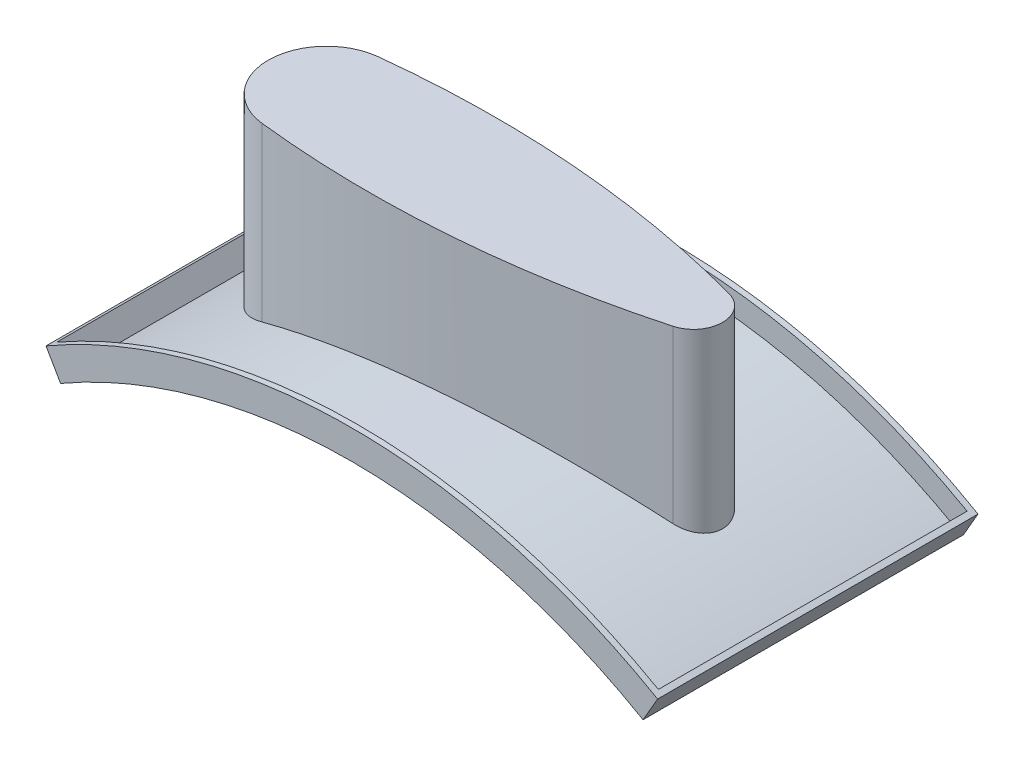
ISO-10303-21;
HEADER;
FILE_DESCRIPTION(('STEP AP214'),'2;1');
FILE_NAME('part.step','',(''),(''),'','','');
FILE_SCHEMA(('AUTOMOTIVE_DESIGN { 1 0 10303 214 1 1 1 1 }'));
ENDSEC;
DATA;
#1=APPLICATION_CONTEXT('core data for automotive mechanical design processes');
#2=APPLICATION_PROTOCOL_DEFINITION('international standard','automotive_design',2000,#1);
#3=PRODUCT_CONTEXT('',#1,'mechanical');
#4=PRODUCT('Part','Part','',(#3));
#5=PRODUCT_RELATED_PRODUCT_CATEGORY('part','',(#4));
#6=PRODUCT_DEFINITION_FORMATION('','',#4);
#7=PRODUCT_DEFINITION_CONTEXT('part definition',#1,'design');
#8=PRODUCT_DEFINITION('design','',#6,#7);
#9=PRODUCT_DEFINITION_SHAPE('','',#8);
#10=(LENGTH_UNIT() NAMED_UNIT(*) SI_UNIT(.MILLI.,.METRE.));
#11=(NAMED_UNIT(*) PLANE_ANGLE_UNIT() SI_UNIT($,.RADIAN.));
#12=(NAMED_UNIT(*) SI_UNIT($,.STERADIAN.) SOLID_ANGLE_UNIT());
#13=UNCERTAINTY_MEASURE_WITH_UNIT(LENGTH_MEASURE(1.E-05),#10,'distance_accuracy_value','');
#14=(GEOMETRIC_REPRESENTATION_CONTEXT(3) GLOBAL_UNCERTAINTY_ASSIGNED_CONTEXT((#13)) GLOBAL_UNIT_ASSIGNED_CONTEXT((#10,
#11,#12)) REPRESENTATION_CONTEXT('',''));
#15=CARTESIAN_POINT('',(0.,0.,0.));
#16=DIRECTION('',(0.,0.,1.));
#17=DIRECTION('',(1.,0.,0.));
#18=AXIS2_PLACEMENT_3D('',#15,#16,#17);
#19=CARTESIAN_POINT('',(0.,0.,-110.));
#20=DIRECTION('',(0.,0.,1.));
#21=DIRECTION('',(1.,0.,0.));
#22=AXIS2_PLACEMENT_3D('',#19,#20,#21);
#23=CYLINDRICAL_SURFACE('',#22,210.);
#24=CARTESIAN_POINT('',(0.,0.,0.));
#25=DIRECTION('',(0.,0.,1.));
#26=DIRECTION('',(-1.,0.,0.));
#27=AXIS2_PLACEMENT_3D('',#24,#25,#26);
#28=CIRCLE('',#27,210.);
#29=CARTESIAN_POINT('',(105.,181.865334794732,0.));
#30=VERTEX_POINT('',#29);
#31=CARTESIAN_POINT('',(-105.,181.865334794732,0.));
#32=VERTEX_POINT('',#31);
#33=EDGE_CURVE('E244',#30,#32,#28,.T.);
#34=ORIENTED_EDGE('',*,*,#33,.F.);
#35=DIRECTION('',(0.,0.,1.));
#36=VECTOR('',#35,1.);
#37=CARTESIAN_POINT('',(105.,181.865334794732,-110.));
#38=LINE('',#37,#36);
#39=CARTESIAN_POINT('',(105.,181.865334794732,-110.));
#40=VERTEX_POINT('',#39);
#41=EDGE_CURVE('E241',#40,#30,#38,.T.);
#42=ORIENTED_EDGE('',*,*,#41,.F.);
#43=CARTESIAN_POINT('',(0.,0.,-110.));
#44=DIRECTION('',(0.,0.,1.));
#45=DIRECTION('',(-1.,0.,0.));
#46=AXIS2_PLACEMENT_3D('',#43,#44,#45);
#47=CIRCLE('',#46,210.);
#48=CARTESIAN_POINT('',(-105.,181.865334794732,-110.));
#49=VERTEX_POINT('',#48);
#50=EDGE_CURVE('E264',#40,#49,#47,.T.);
#51=ORIENTED_EDGE('',*,*,#50,.T.);
#52=DIRECTION('',(0.,0.,1.));
#53=VECTOR('',#52,1.);
#54=CARTESIAN_POINT('',(-105.,181.865334794732,-110.));
#55=LINE('',#54,#53);
#56=EDGE_CURVE('E42',#49,#32,#55,.T.);
#57=ORIENTED_EDGE('',*,*,#56,.T.);
#58=EDGE_LOOP('',(#34,#42,#51,#57));
#59=FACE_BOUND('',#58,.T.);
#60=DIRECTION('',(0.,0.,1.));
#61=VECTOR('',#60,1.);
#62=CARTESIAN_POINT('',(103.263187179685,182.857086746709,-108.));
#63=LINE('',#62,#61);
#64=CARTESIAN_POINT('',(103.263187179685,182.857086746709,-108.));
#65=VERTEX_POINT('',#64);
#66=CARTESIAN_POINT('',(103.263187179685,182.857086746709,-2.));
#67=VERTEX_POINT('',#66);
#68=EDGE_CURVE('E277',#65,#67,#63,.T.);
#69=ORIENTED_EDGE('',*,*,#68,.T.);
#70=CARTESIAN_POINT('',(0.,0.,-2.));
#71=DIRECTION('',(0.,0.,-1.));
#72=DIRECTION('',(-1.,0.,0.));
#73=AXIS2_PLACEMENT_3D('',#70,#71,#72);
#74=CIRCLE('',#73,210.);
#75=CARTESIAN_POINT('',(-103.263187179685,182.857086746709,-2.));
#76=VERTEX_POINT('',#75);
#77=EDGE_CURVE('E281',#67,#76,#74,.F.);
#78=ORIENTED_EDGE('',*,*,#77,.T.);
#79=DIRECTION('',(0.,0.,1.));
#80=VECTOR('',#79,1.);
#81=CARTESIAN_POINT('',(-103.263187179685,182.857086746709,-108.));
#82=LINE('',#81,#80);
#83=CARTESIAN_POINT('',(-103.263187179685,182.857086746709,-108.));
#84=VERTEX_POINT('',#83);
#85=EDGE_CURVE('E254',#84,#76,#82,.T.);
#86=ORIENTED_EDGE('',*,*,#85,.F.);
#87=CARTESIAN_POINT('',(0.,0.,-108.));
#88=DIRECTION('',(0.,0.,-1.));
#89=DIRECTION('',(-1.,0.,0.));
#90=AXIS2_PLACEMENT_3D('',#87,#88,#89);
#91=CIRCLE('',#90,210.);
#92=EDGE_CURVE('E272',#65,#84,#91,.F.);
#93=ORIENTED_EDGE('',*,*,#92,.F.);
#94=EDGE_LOOP('',(#69,#78,#86,#93));
#95=FACE_BOUND('',#94,.T.);
#96=ADVANCED_FACE('F33',(#59,#95),#23,.T.);
#97=CARTESIAN_POINT('',(0.,0.,-110.));
#98=DIRECTION('',(0.,0.,1.));
#99=DIRECTION('',(1.,0.,0.));
#100=AXIS2_PLACEMENT_3D('',#97,#98,#99);
#101=CYLINDRICAL_SURFACE('',#100,200.);
#102=CARTESIAN_POINT('',(0.,0.,0.));
#103=DIRECTION('',(0.,0.,-1.));
#104=DIRECTION('',(-1.,0.,0.));
#105=AXIS2_PLACEMENT_3D('',#102,#103,#104);
#106=CIRCLE('',#105,200.);
#107=CARTESIAN_POINT('',(-100.,173.205080756888,0.));
#108=VERTEX_POINT('',#107);
#109=CARTESIAN_POINT('',(100.,173.205080756888,0.));
#110=VERTEX_POINT('',#109);
#111=EDGE_CURVE('E245',#108,#110,#106,.T.);
#112=ORIENTED_EDGE('',*,*,#111,.F.);
#113=DIRECTION('',(0.,0.,1.));
#114=VECTOR('',#113,1.);
#115=CARTESIAN_POINT('',(-100.,173.205080756888,-110.));
#116=LINE('',#115,#114);
#117=CARTESIAN_POINT('',(-100.,173.205080756888,-110.));
#118=VERTEX_POINT('',#117);
#119=EDGE_CURVE('E11',#118,#108,#116,.T.);
#120=ORIENTED_EDGE('',*,*,#119,.F.);
#121=CARTESIAN_POINT('',(0.,0.,-110.));
#122=DIRECTION('',(0.,0.,-1.));
#123=DIRECTION('',(-1.,0.,0.));
#124=AXIS2_PLACEMENT_3D('',#121,#122,#123);
#125=CIRCLE('',#124,200.);
#126=CARTESIAN_POINT('',(100.,173.205080756888,-110.));
#127=VERTEX_POINT('',#126);
#128=EDGE_CURVE('E260',#118,#127,#125,.T.);
#129=ORIENTED_EDGE('',*,*,#128,.T.);
#130=DIRECTION('',(0.,0.,1.));
#131=VECTOR('',#130,1.);
#132=CARTESIAN_POINT('',(100.,173.205080756888,-110.));
#133=LINE('',#132,#131);
#134=EDGE_CURVE('E37',#127,#110,#133,.T.);
#135=ORIENTED_EDGE('',*,*,#134,.T.);
#136=EDGE_LOOP('',(#112,#120,#129,#135));
#137=FACE_BOUND('',#136,.T.);
#138=ADVANCED_FACE('F35',(#137),#101,.F.);
#139=CARTESIAN_POINT('',(-105.,181.865334794732,-110.));
#140=DIRECTION('',(-0.866025403784438,-0.500000000000002,0.));
#141=DIRECTION('',(0.500000000000002,-0.866025403784438,0.));
#142=AXIS2_PLACEMENT_3D('',#139,#140,#141);
#143=PLANE('',#142);
#144=DIRECTION('',(0.500000000000002,-0.866025403784438,0.));
#145=VECTOR('',#144,1.);
#146=CARTESIAN_POINT('',(-105.,181.865334794732,0.));
#147=LINE('',#146,#145);
#148=EDGE_CURVE('E250',#32,#108,#147,.T.);
#149=ORIENTED_EDGE('',*,*,#148,.F.);
#150=ORIENTED_EDGE('',*,*,#56,.F.);
#151=DIRECTION('',(0.500000000000002,-0.866025403784438,0.));
#152=VECTOR('',#151,1.);
#153=CARTESIAN_POINT('',(-105.,181.865334794732,-110.));
#154=LINE('',#153,#152);
#155=EDGE_CURVE('E256',#49,#118,#154,.T.);
#156=ORIENTED_EDGE('',*,*,#155,.T.);
#157=ORIENTED_EDGE('',*,*,#119,.T.);
#158=EDGE_LOOP('',(#149,#150,#156,#157));
#159=FACE_BOUND('',#158,.T.);
#160=ADVANCED_FACE('F225',(#159),#143,.T.);
#161=CARTESIAN_POINT('',(105.,181.865334794732,-110.));
#162=DIRECTION('',(0.866025403784438,-0.500000000000001,0.));
#163=DIRECTION('',(0.500000000000001,0.866025403784438,0.));
#164=AXIS2_PLACEMENT_3D('',#161,#162,#163);
#165=PLANE('',#164);
#166=DIRECTION('',(0.500000000000001,0.866025403784438,0.));
#167=VECTOR('',#166,1.);
#168=CARTESIAN_POINT('',(105.,181.865334794732,0.));
#169=LINE('',#168,#167);
#170=EDGE_CURVE('E237',#110,#30,#169,.T.);
#171=ORIENTED_EDGE('',*,*,#170,.F.);
#172=ORIENTED_EDGE('',*,*,#134,.F.);
#173=DIRECTION('',(0.500000000000001,0.866025403784438,0.));
#174=VECTOR('',#173,1.);
#175=CARTESIAN_POINT('',(105.,181.865334794732,-110.));
#176=LINE('',#175,#174);
#177=EDGE_CURVE('E267',#127,#40,#176,.T.);
#178=ORIENTED_EDGE('',*,*,#177,.T.);
#179=ORIENTED_EDGE('',*,*,#41,.T.);
#180=EDGE_LOOP('',(#171,#172,#178,#179));
#181=FACE_BOUND('',#180,.T.);
#182=ADVANCED_FACE('F220',(#181),#165,.T.);
#183=CARTESIAN_POINT('',(0.,0.,-110.));
#184=DIRECTION('',(0.,0.,-1.));
#185=DIRECTION('',(-1.,0.,0.));
#186=AXIS2_PLACEMENT_3D('',#183,#184,#185);
#187=PLANE('',#186);
#188=ORIENTED_EDGE('',*,*,#128,.F.);
#189=ORIENTED_EDGE('',*,*,#155,.F.);
#190=ORIENTED_EDGE('',*,*,#50,.F.);
#191=ORIENTED_EDGE('',*,*,#177,.F.);
#192=EDGE_LOOP('',(#188,#189,#190,#191));
#193=FACE_BOUND('',#192,.T.);
#194=ADVANCED_FACE('F217',(#193),#187,.T.);
#195=CARTESIAN_POINT('',(0.,0.,0.));
#196=DIRECTION('',(0.,0.,-1.));
#197=DIRECTION('',(-1.,0.,0.));
#198=AXIS2_PLACEMENT_3D('',#195,#196,#197);
#199=PLANE('',#198);
#200=ORIENTED_EDGE('',*,*,#111,.T.);
#201=ORIENTED_EDGE('',*,*,#170,.T.);
#202=ORIENTED_EDGE('',*,*,#33,.T.);
#203=ORIENTED_EDGE('',*,*,#148,.T.);
#204=EDGE_LOOP('',(#200,#201,#202,#203));
#205=FACE_BOUND('',#204,.T.);
#206=ADVANCED_FACE('F201',(#205),#199,.F.);
#207=CARTESIAN_POINT('',(0.,0.,-110.));
#208=DIRECTION('',(0.,0.,1.));
#209=DIRECTION('',(1.,0.,0.));
#210=AXIS2_PLACEMENT_3D('',#207,#208,#209);
#211=CYLINDRICAL_SURFACE('',#210,202.);
#212=CARTESIAN_POINT('',(64.9296498683862,191.280267063722,-64.6466484472208));
#213=CARTESIAN_POINT('',(65.2084290098721,191.18564205113,-64.570525451564));
#214=CARTESIAN_POINT('',(65.4840286327089,191.091404925874,-64.4822451652544));
#215=CARTESIAN_POINT('',(66.0270378807425,190.904458120243,-64.2819406085647));
#216=CARTESIAN_POINT('',(66.2944464335709,190.811748640595,-64.1699132443134));
#217=CARTESIAN_POINT('',(66.8196108528369,190.628479643653,-63.9224970773702));
#218=CARTESIAN_POINT('',(67.0773497012129,190.537924010882,-63.787069241679));
#219=CARTESIAN_POINT('',(67.5808188371485,190.359933223706,-63.4937269028817));
#220=CARTESIAN_POINT('',(67.8265497213364,190.272497914322,-63.3358135185228));
#221=CARTESIAN_POINT('',(68.3044975194709,190.101447010031,-62.9981166377396));
#222=CARTESIAN_POINT('',(68.5366945041239,190.01783708526,-62.8183020365991));
#223=CARTESIAN_POINT('',(68.9853225344908,189.855424450266,-62.4380128114217));
#224=CARTESIAN_POINT('',(69.2017539247104,189.776621635005,-62.2375386390635));
#225=CARTESIAN_POINT('',(69.6168384410889,189.624746856974,-61.817303426818));
#226=CARTESIAN_POINT('',(69.8155059455532,189.551670265363,-61.5975582757847));
#227=CARTESIAN_POINT('',(70.1934448449854,189.412040000585,-61.1400500315196));
#228=CARTESIAN_POINT('',(70.3727171788864,189.345486011668,-60.9022878114545));
#229=CARTESIAN_POINT('',(70.7036307950189,189.222161957635,-60.4198377600409));
#230=CARTESIAN_POINT('',(70.8560695896856,189.16511404868,-60.1757679728745));
#231=CARTESIAN_POINT('',(71.1399263182597,189.058546165923,-59.6741466453433));
#232=CARTESIAN_POINT('',(71.2713462109632,189.009025490664,-59.4165963642269));
#233=CARTESIAN_POINT('',(71.511823327335,188.918171860167,-58.8898841996434));
#234=CARTESIAN_POINT('',(71.6208820120897,188.876838369983,-58.6207230762233));
#235=CARTESIAN_POINT('',(71.8154604374126,188.802940893767,-58.0728574226828));
#236=CARTESIAN_POINT('',(71.9009815210386,188.770376407378,-57.7941534380997));
#237=CARTESIAN_POINT('',(72.0428698374558,188.716269291927,-57.2473856010244));
#238=CARTESIAN_POINT('',(72.100741679665,188.69415876735,-56.9797674482759));
#239=CARTESIAN_POINT('',(72.1943934682439,188.658347481977,-56.4401411668987));
#240=CARTESIAN_POINT('',(72.2301744131612,188.644646341064,-56.1681332372661));
#241=CARTESIAN_POINT('',(72.2792588755022,188.625845071382,-55.6218875633253));
#242=CARTESIAN_POINT('',(72.2925694274451,188.620742250848,-55.3476505438742));
#243=CARTESIAN_POINT('',(72.2965917102592,188.619200599193,-54.7989876124281));
#244=CARTESIAN_POINT('',(72.2873038423875,188.622761614239,-54.5245617038736));
#245=CARTESIAN_POINT('',(72.2470378632983,188.638187954362,-53.9883838670679));
#246=CARTESIAN_POINT('',(72.216924553273,188.649722174522,-53.7265569197438));
#247=CARTESIAN_POINT('',(72.1362298233822,188.680593095153,-53.206552104609));
#248=CARTESIAN_POINT('',(72.0856490786756,188.699929538252,-52.9483741167207));
#249=CARTESIAN_POINT('',(71.9645037038445,188.746163942889,-52.4374382587138));
#250=CARTESIAN_POINT('',(71.8939384464283,188.77306214178,-52.1846805590001));
#251=CARTESIAN_POINT('',(71.733481314272,188.834093898576,-51.6862756873072));
#252=CARTESIAN_POINT('',(71.6435890963137,188.86822758497,-51.4406286416908));
#253=CARTESIAN_POINT('',(71.4443823888776,188.943673255953,-50.955825468719));
#254=CARTESIAN_POINT('',(71.3348990433742,188.985047573249,-50.7167484781193));
#255=CARTESIAN_POINT('',(71.0980246174222,189.07428937988,-50.2489101797888));
#256=CARTESIAN_POINT('',(70.9706335125979,189.122156878053,-50.0201488861));
#257=CARTESIAN_POINT('',(70.6990083826321,189.223865389084,-49.5742977448794));
#258=CARTESIAN_POINT('',(70.5547763928911,189.277705680026,-49.3572064915207));
#259=CARTESIAN_POINT('',(70.2505235125144,189.390840041098,-48.9357751859903));
#260=CARTESIAN_POINT('',(70.0904967163419,189.450136150541,-48.73143995015));
#261=CARTESIAN_POINT('',(69.7477039804107,189.576614489062,-48.32702435322));
#262=CARTESIAN_POINT('',(69.5642097397869,189.644040269537,-48.1276373082569));
#263=CARTESIAN_POINT('',(69.1825106196773,189.783617643662,-47.7451287751557));
#264=CARTESIAN_POINT('',(68.9843001443304,189.855771033754,-47.5620135331312));
#265=CARTESIAN_POINT('',(68.5746411337868,190.004121130614,-47.2130481318755));
#266=CARTESIAN_POINT('',(68.3631923269142,190.080317920357,-47.0471983271502));
#267=CARTESIAN_POINT('',(67.9284098351502,190.23612818748,-46.7335089728482));
#268=CARTESIAN_POINT('',(67.7050723990457,190.315742741712,-46.5856751568275));
#269=CARTESIAN_POINT('',(67.2773526132734,190.46732660515,-46.3265393878254));
#270=CARTESIAN_POINT('',(67.0742136160395,190.538966620502,-46.2129838349704));
#271=CARTESIAN_POINT('',(66.6609944689876,190.68392634168,-46.0005140261033));
#272=CARTESIAN_POINT('',(66.4509143827352,190.757246032122,-45.9015996360545));
#273=CARTESIAN_POINT('',(66.0251414328622,190.905032215463,-45.7189180030858));
#274=CARTESIAN_POINT('',(65.8094589575511,190.979496494028,-45.6351247361843));
#275=CARTESIAN_POINT('',(65.3730774691143,191.129312795527,-45.4827543317758));
#276=CARTESIAN_POINT('',(65.1523783133275,191.204664843677,-45.4141776275862));
#277=CARTESIAN_POINT('',(64.9296498683862,191.280267063722,-45.3533515527792));
#278=B_SPLINE_CURVE_WITH_KNOTS('',3,(#212,#213,#214,#215,#216,#217,#218,#219,#220,#221,#222,
#223,#224,#225,#226,#227,#228,#229,#230,#231,#232,#233,#234,#235,#236,#237,#238,#239,#240,#241,
#242,#243,#244,#245,#246,#247,#248,#249,#250,#251,#252,#253,#254,#255,#256,#257,#258,#259,#260,
#261,#262,#263,#264,#265,#266,#267,#268,#269,#270,#271,#272,#273,#274,#275,#276,#277),
.UNSPECIFIED.,.F.,.F.,(4,2,2,2,2,2,2,2,2,2,2,2,2,2,2,2,2,2,2,2,2,2,2,2,2,2,2,2,2,2,2,2,4),(0.,
0.9120034262963,1.82412574542361,2.7377844765978,3.65139776542156,4.56632406378289,
5.48123036341661,6.39538929333207,7.30950394838478,8.18846196956055,9.06733803097619,
9.94615664811699,10.8249251093818,11.6479790549772,12.4709957943547,13.2937548345743,
14.1164992660024,14.9069821502443,15.6974389609688,16.4879205860105,17.2784162499999,
18.0760857528508,18.8737563414858,19.6713306227157,20.4692042476825,21.3059833034342,
22.1430821910257,22.9801982631235,23.8175800540092,24.5475485357289,25.2775103343244,
26.0062036060103,26.7349176258123),.UNSPECIFIED.);
#279=CARTESIAN_POINT('',(64.9296498683861,191.280267063722,-64.6466484472208));
#280=VERTEX_POINT('',#279);
#281=CARTESIAN_POINT('',(64.9296498683862,191.280267063722,-45.3533515527792));
#282=VERTEX_POINT('',#281);
#283=EDGE_CURVE('E50',#280,#282,#278,.T.);
#284=ORIENTED_EDGE('',*,*,#283,.T.);
#285=CARTESIAN_POINT('',(-65.8972379589517,190.949087532204,-35.1220577451207));
#286=CARTESIAN_POINT('',(-63.5430582509175,191.76156851178,-34.860725824521));
#287=CARTESIAN_POINT('',(-61.1715632704391,192.531214720001,-34.6217534842357));
#288=CARTESIAN_POINT('',(-56.3977320869812,193.983287968843,-34.1904328180949));
#289=CARTESIAN_POINT('',(-53.9953946385818,194.665711475143,-33.9980863812695));
#290=CARTESIAN_POINT('',(-49.1634495498331,195.941831803618,-33.6619153577741));
#291=CARTESIAN_POINT('',(-46.7338373542973,196.535513560596,-33.5180990045894));
#292=CARTESIAN_POINT('',(-41.8519268915671,197.632676902545,-33.2806363582339));
#293=CARTESIAN_POINT('',(-39.3996289440788,198.136159756641,-33.1869893591286));
#294=CARTESIAN_POINT('',(-34.4792026232026,199.051350436016,-33.0512777175403));
#295=CARTESIAN_POINT('',(-32.0110935398214,199.463153916024,-33.0091591040369));
#296=CARTESIAN_POINT('',(-27.0609504930528,200.194816871221,-32.9773695941261));
#297=CARTESIAN_POINT('',(-24.5789165762666,200.514676653923,-32.9876985223011));
#298=CARTESIAN_POINT('',(-19.605772677488,201.061858063504,-33.0615391657116));
#299=CARTESIAN_POINT('',(-17.1146638875529,201.289191431515,-33.1250441300501));
#300=CARTESIAN_POINT('',(-12.1276605712497,201.651109928682,-33.3056522292279));
#301=CARTESIAN_POINT('',(-9.63176605311316,201.785695217225,-33.4227552719591));
#302=CARTESIAN_POINT('',(-4.63629711579084,201.962273676371,-33.7108664566843));
#303=CARTESIAN_POINT('',(-2.13672244649385,202.004136679545,-33.8819499945883));
#304=CARTESIAN_POINT('',(2.85801254562318,201.995219434537,-34.2777568067588));
#305=CARTESIAN_POINT('',(5.35317285456641,201.944438895641,-34.5024802493449));
#306=CARTESIAN_POINT('',(10.3349561588304,201.7508454566,-35.0050790023986));
#307=CARTESIAN_POINT('',(12.8215776974143,201.60801756774,-35.2829629641835));
#308=CARTESIAN_POINT('',(17.7814520762124,201.231224027061,-35.8910258863927));
#309=CARTESIAN_POINT('',(20.2547050360568,200.997259192164,-36.2212043780496));
#310=CARTESIAN_POINT('',(25.1798422977621,200.439786834687,-36.932195708365));
#311=CARTESIAN_POINT('',(27.6317535546696,200.11641719151,-37.3129301139311));
#312=CARTESIAN_POINT('',(32.5141029061902,199.381362465142,-38.1240625372977));
#313=CARTESIAN_POINT('',(34.9445402901169,198.969674470335,-38.5544621922111));
#314=CARTESIAN_POINT('',(39.7789696986792,198.059791761018,-39.4630942081841));
#315=CARTESIAN_POINT('',(42.1829728323612,197.561634987725,-39.9413055513257));
#316=CARTESIAN_POINT('',(46.9618498708009,196.480495482386,-40.9438501845432));
#317=CARTESIAN_POINT('',(49.3367273568921,195.897523295097,-41.4681777379783));
#318=CARTESIAN_POINT('',(52.8144731590344,194.976849806918,-42.2737711710371));
#319=CARTESIAN_POINT('',(53.9299254799934,194.671256717662,-42.537964269226));
#320=CARTESIAN_POINT('',(56.1530740955215,194.041662034138,-43.0760101370484));
#321=CARTESIAN_POINT('',(57.2607717261037,193.717663703078,-43.3498611911041));
#322=CARTESIAN_POINT('',(59.466691363181,193.051905114585,-43.9066290437693));
#323=CARTESIAN_POINT('',(60.5649246421539,192.71017088213,-44.1895323379291));
#324=CARTESIAN_POINT('',(62.7534020281895,192.008674909572,-44.7645810328415));
#325=CARTESIAN_POINT('',(63.843644749778,191.648910124145,-45.0567279917378));
#326=CARTESIAN_POINT('',(64.9296498683862,191.280267063722,-45.3533515527792));
#327=B_SPLINE_CURVE_WITH_KNOTS('',3,(#285,#286,#287,#288,#289,#290,#291,#292,#293,#294,#295,
#296,#297,#298,#299,#300,#301,#302,#303,#304,#305,#306,#307,#308,#309,#310,#311,#312,#313,#314,
#315,#316,#317,#318,#319,#320,#321,#322,#323,#324,#325,#326),.UNSPECIFIED.,.F.,.F.,(4,2,2,2,2,2,
2,2,2,2,2,2,2,2,2,2,2,2,2,2,4),(0.,7.5118841944323,15.0240726790493,22.5375350215961,
30.0508916391776,37.5563719834138,45.0618272246098,52.5663297645738,60.0708194081221,
67.585837509182,75.1008791923325,82.6171449117471,90.1333432592912,97.6380142263586,
105.142932640173,112.644566293497,120.145268094953,123.704143966449,127.262390814915,
130.815556438553,134.369324220605),.UNSPECIFIED.);
#328=CARTESIAN_POINT('',(-65.8972379589517,190.949087532204,-35.1220577451207));
#329=VERTEX_POINT('',#328);
#330=EDGE_CURVE('E130',#329,#282,#327,.T.);
#331=ORIENTED_EDGE('',*,*,#330,.F.);
#332=CARTESIAN_POINT('',(-65.8972379589517,190.949087532204,-35.1220577451207));
#333=CARTESIAN_POINT('',(-66.4875490151741,190.7453969043,-35.1875464562004));
#334=CARTESIAN_POINT('',(-67.0742327326564,190.539839582577,-35.2793091043062));
#335=CARTESIAN_POINT('',(-68.2364465164588,190.126707517789,-35.5143574934215));
#336=CARTESIAN_POINT('',(-68.8119769121714,189.919132834577,-35.6576417103867));
#337=CARTESIAN_POINT('',(-69.9485341846374,189.503481886224,-35.9948648764962));
#338=CARTESIAN_POINT('',(-70.5095474734681,189.295405337235,-36.1888495212022));
#339=CARTESIAN_POINT('',(-71.3366923092571,188.98455813079,-36.5167193363864));
#340=CARTESIAN_POINT('',(-71.610022343214,188.881149440825,-36.6321635857642));
#341=CARTESIAN_POINT('',(-72.1515547618413,188.674950957881,-36.875226807424));
#342=CARTESIAN_POINT('',(-72.419755727697,188.572161341388,-37.0028490915777));
#343=CARTESIAN_POINT('',(-73.2160589952311,188.265058381299,-37.4037838588405));
#344=CARTESIAN_POINT('',(-73.7357266294867,188.062061746175,-37.6951107474882));
#345=CARTESIAN_POINT('',(-74.7485598497972,187.66179518701,-38.3240869495664));
#346=CARTESIAN_POINT('',(-75.2417263459928,187.464525066408,-38.6617346707625));
#347=CARTESIAN_POINT('',(-75.9586427934845,187.17465412143,-39.2014284322133));
#348=CARTESIAN_POINT('',(-76.1938117118373,187.079035219496,-39.3868654763958));
#349=CARTESIAN_POINT('',(-76.6560625345383,186.890102468193,-39.7685386452148));
#350=CARTESIAN_POINT('',(-76.8831464731094,186.796788040843,-39.9647720213558));
#351=CARTESIAN_POINT('',(-77.5516773280934,186.520694963305,-40.5693724948266));
#352=CARTESIAN_POINT('',(-77.9804707863712,186.341739166897,-40.9936906970647));
#353=CARTESIAN_POINT('',(-78.7907482310003,186.000556287264,-41.8719036328773));
#354=CARTESIAN_POINT('',(-79.1730940012691,185.838038957935,-42.3248927555361));
#355=CARTESIAN_POINT('',(-79.8981687290731,185.527459403687,-43.2662408282361));
#356=CARTESIAN_POINT('',(-80.2408977136216,185.379397168911,-43.7545997541594));
#357=CARTESIAN_POINT('',(-80.8831042671806,185.100097520944,-44.7633246342297));
#358=CARTESIAN_POINT('',(-81.182594763769,184.968855080241,-45.2836809550729));
#359=CARTESIAN_POINT('',(-81.7350579164061,184.725394868546,-46.3527741931921));
#360=CARTESIAN_POINT('',(-81.9880346449473,184.613175432071,-46.9015086204403));
#361=CARTESIAN_POINT('',(-82.4267697171727,184.417680287844,-47.9797592533974));
#362=CARTESIAN_POINT('',(-82.6162058561764,184.332840486774,-48.5074974704917));
#363=CARTESIAN_POINT('',(-82.9506662942707,184.182574179045,-49.5795638485502));
#364=CARTESIAN_POINT('',(-83.095692834858,184.117146692589,-50.1238911706831));
#365=CARTESIAN_POINT('',(-83.3395197243866,184.006908512075,-51.2245646632478));
#366=CARTESIAN_POINT('',(-83.4383438411726,183.962087217803,-51.7809044996524));
#367=CARTESIAN_POINT('',(-83.5886189238625,183.893854299447,-52.9012392819667));
#368=CARTESIAN_POINT('',(-83.6400726026065,183.870441449332,-53.4652337876265));
#369=CARTESIAN_POINT('',(-83.6928499271823,183.846423889236,-54.552762397418));
#370=CARTESIAN_POINT('',(-83.6977053886036,183.84421228985,-55.0760932662911));
#371=CARTESIAN_POINT('',(-83.6664038364031,183.858459638611,-56.1212504611296));
#372=CARTESIAN_POINT('',(-83.6302493064289,183.874917456101,-56.6430768762891));
#373=CARTESIAN_POINT('',(-83.5173402360428,183.926228966999,-57.681337979907));
#374=CARTESIAN_POINT('',(-83.4405899537327,183.961080731059,-58.1977732280543));
#375=CARTESIAN_POINT('',(-83.2473308737296,184.04861622031,-59.221608989329));
#376=CARTESIAN_POINT('',(-83.1308216660959,184.101300129362,-59.7290094092446));
#377=CARTESIAN_POINT('',(-82.8613967992164,184.22271947252,-60.7234397255008));
#378=CARTESIAN_POINT('',(-82.7090783080466,184.291191295549,-61.2106640198548));
#379=CARTESIAN_POINT('',(-82.3685869897811,184.443624554306,-62.1698947874173));
#380=CARTESIAN_POINT('',(-82.1804148526369,184.527585691965,-62.6419015532609));
#381=CARTESIAN_POINT('',(-81.7699034624017,184.709862470868,-63.5679891316141));
#382=CARTESIAN_POINT('',(-81.5475602242395,184.808179786278,-64.0220678455616));
#383=CARTESIAN_POINT('',(-81.0706039569899,185.017904580856,-64.9097863836523));
#384=CARTESIAN_POINT('',(-80.8159896953781,185.129312559983,-65.3434254262767));
#385=CARTESIAN_POINT('',(-80.2623303237879,185.370046487021,-66.2102511570841));
#386=CARTESIAN_POINT('',(-79.9616551527881,185.500005786562,-66.6422208984823));
#387=CARTESIAN_POINT('',(-79.3291780278097,185.7713645945,-67.4789007990186));
#388=CARTESIAN_POINT('',(-78.9973751427071,185.912764445101,-67.8836101420933));
#389=CARTESIAN_POINT('',(-78.3050427020191,186.20542825743,-68.6639059207798));
#390=CARTESIAN_POINT('',(-77.9445097817604,186.356693374136,-69.0394889351136));
#391=CARTESIAN_POINT('',(-77.1970366409049,186.667569340256,-69.7599806815659));
#392=CARTESIAN_POINT('',(-76.8100846869583,186.827183890404,-70.1048756256611));
#393=CARTESIAN_POINT('',(-75.9796931777338,187.166512594085,-70.7892713468058));
#394=CARTESIAN_POINT('',(-75.5342220086843,187.346802978609,-71.1260241622836));
#395=CARTESIAN_POINT('',(-74.6185968249262,187.713366855992,-71.7600115023702));
#396=CARTESIAN_POINT('',(-74.1484511641412,187.899638315681,-72.0572592831423));
#397=CARTESIAN_POINT('',(-73.1863062228616,188.276476378781,-72.611008848045));
#398=CARTESIAN_POINT('',(-72.6943037043776,188.467043616517,-72.8675045690205));
#399=CARTESIAN_POINT('',(-71.6915994808371,188.850741494969,-73.3384123583303));
#400=CARTESIAN_POINT('',(-71.1809009871416,189.043871691852,-73.5528316141633));
#401=CARTESIAN_POINT('',(-70.2787316698222,189.380748171679,-73.8883468902159));
#402=CARTESIAN_POINT('',(-69.8907793928149,189.524280581485,-74.0192128900708));
#403=CARTESIAN_POINT('',(-69.1075628104489,189.811271225549,-74.2569072815282));
#404=CARTESIAN_POINT('',(-68.7122989958124,189.954729464125,-74.3637372800455));
#405=CARTESIAN_POINT('',(-67.9163991639846,190.240745048928,-74.5528298320312));
#406=CARTESIAN_POINT('',(-67.5157731590601,190.383303495653,-74.6351328919904));
#407=CARTESIAN_POINT('',(-66.7097447284214,190.667231667433,-74.7751033849397));
#408=CARTESIAN_POINT('',(-66.3043414875039,190.808601182339,-74.8327665488612));
#409=CARTESIAN_POINT('',(-65.8972379589517,190.949087532204,-74.8779422548793));
#410=B_SPLINE_CURVE_WITH_KNOTS('',3,(#332,#333,#334,#335,#336,#337,#338,#339,#340,#341,#342,
#343,#344,#345,#346,#347,#348,#349,#350,#351,#352,#353,#354,#355,#356,#357,#358,#359,#360,#361,
#362,#363,#364,#365,#366,#367,#368,#369,#370,#371,#372,#373,#374,#375,#376,#377,#378,#379,#380,
#381,#382,#383,#384,#385,#386,#387,#388,#389,#390,#391,#392,#393,#394,#395,#396,#397,#398,#399,
#400,#401,#402,#403,#404,#405,#406,#407,#408,#409),.UNSPECIFIED.,.F.,.F.,(4,2,2,2,2,2,2,2,2,2,2,
2,2,2,2,2,2,2,2,2,2,2,2,2,2,2,2,2,2,2,2,2,2,2,2,2,2,2,4),(0.,1.88299890302535,3.76594211019774,
5.65058827436356,6.59298882398222,7.53564639810975,9.42142170368584,11.3071322037655,
12.2500069953233,13.1926428536406,15.0776491572831,16.9192662892788,18.7608821655276,
20.6019462843658,22.4428491328116,24.1418800066822,25.8408251108054,27.5388952648158,
29.2368681666205,30.8050269873487,32.3730908422974,33.9409902551178,35.5089058345008,
37.052327719385,38.5957199063474,40.1392922221656,41.682923509275,43.3075276213783,
44.9321803458039,46.5570236193302,48.1825932802904,49.9411067650383,51.6990286715859,
53.4572118800728,55.2150944938896,56.515993434245,57.8168053777943,59.1154569574388,
60.4143334482233),.UNSPECIFIED.);
#411=CARTESIAN_POINT('',(-65.8972379589517,190.949087532204,-74.8779422548793));
#412=VERTEX_POINT('',#411);
#413=EDGE_CURVE('E147',#329,#412,#410,.T.);
#414=ORIENTED_EDGE('',*,*,#413,.T.);
#415=CARTESIAN_POINT('',(-65.8972379589516,190.949087532204,-74.8779422548794));
#416=CARTESIAN_POINT('',(-63.5430582509174,191.76156851178,-75.139274175479));
#417=CARTESIAN_POINT('',(-61.1715632704389,192.531214720001,-75.3782465157643));
#418=CARTESIAN_POINT('',(-56.397732086981,193.983287968843,-75.8095671819051));
#419=CARTESIAN_POINT('',(-53.9953946385817,194.665711475143,-76.0019136187305));
#420=CARTESIAN_POINT('',(-49.163449549833,195.941831803618,-76.3380846422259));
#421=CARTESIAN_POINT('',(-46.7338373542971,196.535513560597,-76.4819009954106));
#422=CARTESIAN_POINT('',(-41.8519268915669,197.632676902545,-76.7193636417661));
#423=CARTESIAN_POINT('',(-39.3996289440786,198.136159756641,-76.8130106408714));
#424=CARTESIAN_POINT('',(-34.4792026232024,199.051350436016,-76.9487222824597));
#425=CARTESIAN_POINT('',(-32.0110935398212,199.463153916024,-76.990840895963));
#426=CARTESIAN_POINT('',(-27.0609504930527,200.194816871221,-77.0226304058738));
#427=CARTESIAN_POINT('',(-24.5789165762664,200.514676653923,-77.0123014776989));
#428=CARTESIAN_POINT('',(-19.6057726774878,201.061858063504,-76.9384608342884));
#429=CARTESIAN_POINT('',(-17.1146638875527,201.289191431515,-76.8749558699499));
#430=CARTESIAN_POINT('',(-12.1276605712495,201.651109928682,-76.694347770772));
#431=CARTESIAN_POINT('',(-9.631766053113,201.785695217225,-76.5772447280409));
#432=CARTESIAN_POINT('',(-4.63629711579069,201.962273676371,-76.2891335433156));
#433=CARTESIAN_POINT('',(-2.1367224464937,202.004136679545,-76.1180500054116));
#434=CARTESIAN_POINT('',(2.85801254562333,201.995219434537,-75.7222431932411));
#435=CARTESIAN_POINT('',(5.35317285456656,201.944438895641,-75.497519750655));
#436=CARTESIAN_POINT('',(10.3349561588306,201.7508454566,-74.9949209976014));
#437=CARTESIAN_POINT('',(12.8215776974145,201.60801756774,-74.7170370358164));
#438=CARTESIAN_POINT('',(17.7814520762125,201.231224027061,-74.1089741136073));
#439=CARTESIAN_POINT('',(20.2547050360569,200.997259192164,-73.7787956219504));
#440=CARTESIAN_POINT('',(25.1798422977623,200.439786834687,-73.0678042916349));
#441=CARTESIAN_POINT('',(27.6317535546697,200.11641719151,-72.687069886069));
#442=CARTESIAN_POINT('',(32.5141029061904,199.381362465142,-71.8759374627023));
#443=CARTESIAN_POINT('',(34.944540290117,198.969674470335,-71.4455378077888));
#444=CARTESIAN_POINT('',(39.7789696986793,198.059791761018,-70.5369057918158));
#445=CARTESIAN_POINT('',(42.1829728323613,197.561634987725,-70.0586944486743));
#446=CARTESIAN_POINT('',(46.961849870801,196.480495482386,-69.0561498154567));
#447=CARTESIAN_POINT('',(49.3367273568922,195.897523295096,-68.5318222620216));
#448=CARTESIAN_POINT('',(52.8144731590345,194.976849806918,-67.7262288289628));
#449=CARTESIAN_POINT('',(53.9299254799936,194.671256717662,-67.4620357307739));
#450=CARTESIAN_POINT('',(56.1530740955216,194.041662034138,-66.9239898629516));
#451=CARTESIAN_POINT('',(57.2607717261037,193.717663703078,-66.6501388088959));
#452=CARTESIAN_POINT('',(59.4666913631811,193.051905114585,-66.0933709562308));
#453=CARTESIAN_POINT('',(60.5649246421539,192.71017088213,-65.810467662071));
#454=CARTESIAN_POINT('',(62.7534020281895,192.008674909572,-65.2354189671585));
#455=CARTESIAN_POINT('',(63.8436447497779,191.648910124145,-64.9432720082622));
#456=CARTESIAN_POINT('',(64.9296498683861,191.280267063722,-64.6466484472208));
#457=B_SPLINE_CURVE_WITH_KNOTS('',3,(#415,#416,#417,#418,#419,#420,#421,#422,#423,#424,#425,
#426,#427,#428,#429,#430,#431,#432,#433,#434,#435,#436,#437,#438,#439,#440,#441,#442,#443,#444,
#445,#446,#447,#448,#449,#450,#451,#452,#453,#454,#455,#456),.UNSPECIFIED.,.F.,.F.,(4,2,2,2,2,2,
2,2,2,2,2,2,2,2,2,2,2,2,2,2,4),(0.,7.51188419443231,15.0240726790493,22.5375350215961,
30.0508916391777,37.5563719834138,45.0618272246099,52.5663297645738,60.0708194081221,
67.585837509182,75.1008791923325,82.6171449117471,90.1333432592912,97.6380142263586,
105.142932640173,112.644566293497,120.145268094953,123.704143966449,127.262390814915,
130.815556438553,134.369324220605),.UNSPECIFIED.);
#458=EDGE_CURVE('E55',#412,#280,#457,.T.);
#459=ORIENTED_EDGE('',*,*,#458,.T.);
#460=EDGE_LOOP('',(#284,#331,#414,#459));
#461=FACE_BOUND('',#460,.T.);
#462=CARTESIAN_POINT('',(0.,0.,-2.));
#463=DIRECTION('',(0.,0.,-1.));
#464=DIRECTION('',(-1.,0.,0.));
#465=AXIS2_PLACEMENT_3D('',#462,#463,#464);
#466=CIRCLE('',#465,202.);
#467=CARTESIAN_POINT('',(-99.2629985760519,175.928556845359,-2.));
#468=VERTEX_POINT('',#467);
#469=CARTESIAN_POINT('',(99.2629985760519,175.928556845359,-2.));
#470=VERTEX_POINT('',#469);
#471=EDGE_CURVE('E170',#468,#470,#466,.T.);
#472=ORIENTED_EDGE('',*,*,#471,.T.);
#473=DIRECTION('',(0.,0.,1.));
#474=VECTOR('',#473,1.);
#475=CARTESIAN_POINT('',(99.2629985760519,175.928556845359,-108.));
#476=LINE('',#475,#474);
#477=CARTESIAN_POINT('',(99.2629985760519,175.928556845359,-108.));
#478=VERTEX_POINT('',#477);
#479=EDGE_CURVE('E280',#478,#470,#476,.T.);
#480=ORIENTED_EDGE('',*,*,#479,.F.);
#481=CARTESIAN_POINT('',(0.,0.,-108.));
#482=DIRECTION('',(0.,0.,-1.));
#483=DIRECTION('',(-1.,0.,0.));
#484=AXIS2_PLACEMENT_3D('',#481,#482,#483);
#485=CIRCLE('',#484,202.);
#486=CARTESIAN_POINT('',(-99.2629985760519,175.928556845359,-108.));
#487=VERTEX_POINT('',#486);
#488=EDGE_CURVE('E291',#487,#478,#485,.T.);
#489=ORIENTED_EDGE('',*,*,#488,.F.);
#490=DIRECTION('',(0.,0.,1.));
#491=VECTOR('',#490,1.);
#492=CARTESIAN_POINT('',(-99.2629985760519,175.928556845359,-108.));
#493=LINE('',#492,#491);
#494=EDGE_CURVE('E252',#487,#468,#493,.T.);
#495=ORIENTED_EDGE('',*,*,#494,.T.);
#496=EDGE_LOOP('',(#472,#480,#489,#495));
#497=FACE_BOUND('',#496,.T.);
#498=ADVANCED_FACE('F197',(#461,#497),#211,.T.);
#499=CARTESIAN_POINT('',(-103.267949192431,182.865334794732,-110.));
#500=DIRECTION('',(-0.866025403784438,-0.500000000000002,0.));
#501=DIRECTION('',(0.500000000000002,-0.866025403784438,0.));
#502=AXIS2_PLACEMENT_3D('',#499,#500,#501);
#503=PLANE('',#502);
#504=DIRECTION('',(0.500000000000002,-0.866025403784438,0.));
#505=VECTOR('',#504,1.);
#506=CARTESIAN_POINT('',(-103.267949192431,182.865334794732,-2.));
#507=LINE('',#506,#505);
#508=EDGE_CURVE('E284',#76,#468,#507,.T.);
#509=ORIENTED_EDGE('',*,*,#508,.T.);
#510=ORIENTED_EDGE('',*,*,#494,.F.);
#511=DIRECTION('',(0.500000000000002,-0.866025403784438,0.));
#512=VECTOR('',#511,1.);
#513=CARTESIAN_POINT('',(-103.267949192431,182.865334794732,-108.));
#514=LINE('',#513,#512);
#515=EDGE_CURVE('E275',#84,#487,#514,.T.);
#516=ORIENTED_EDGE('',*,*,#515,.F.);
#517=ORIENTED_EDGE('',*,*,#85,.T.);
#518=EDGE_LOOP('',(#509,#510,#516,#517));
#519=FACE_BOUND('',#518,.T.);
#520=ADVANCED_FACE('F200',(#519),#503,.F.);
#521=CARTESIAN_POINT('',(103.267949192431,182.865334794732,-110.));
#522=DIRECTION('',(0.866025403784438,-0.500000000000001,0.));
#523=DIRECTION('',(0.500000000000001,0.866025403784438,0.));
#524=AXIS2_PLACEMENT_3D('',#521,#522,#523);
#525=PLANE('',#524);
#526=DIRECTION('',(0.500000000000001,0.866025403784438,0.));
#527=VECTOR('',#526,1.);
#528=CARTESIAN_POINT('',(103.267949192431,182.865334794732,-2.));
#529=LINE('',#528,#527);
#530=EDGE_CURVE('E285',#470,#67,#529,.T.);
#531=ORIENTED_EDGE('',*,*,#530,.T.);
#532=ORIENTED_EDGE('',*,*,#68,.F.);
#533=DIRECTION('',(0.500000000000001,0.866025403784438,0.));
#534=VECTOR('',#533,1.);
#535=CARTESIAN_POINT('',(103.267949192431,182.865334794732,-108.));
#536=LINE('',#535,#534);
#537=EDGE_CURVE('E276',#478,#65,#536,.T.);
#538=ORIENTED_EDGE('',*,*,#537,.F.);
#539=ORIENTED_EDGE('',*,*,#479,.T.);
#540=EDGE_LOOP('',(#531,#532,#538,#539));
#541=FACE_BOUND('',#540,.T.);
#542=ADVANCED_FACE('F204',(#541),#525,.F.);
#543=CARTESIAN_POINT('',(0.,0.,-108.));
#544=DIRECTION('',(0.,0.,-1.));
#545=DIRECTION('',(-1.,0.,0.));
#546=AXIS2_PLACEMENT_3D('',#543,#544,#545);
#547=PLANE('',#546);
#548=ORIENTED_EDGE('',*,*,#488,.T.);
#549=ORIENTED_EDGE('',*,*,#537,.T.);
#550=ORIENTED_EDGE('',*,*,#92,.T.);
#551=ORIENTED_EDGE('',*,*,#515,.T.);
#552=EDGE_LOOP('',(#548,#549,#550,#551));
#553=FACE_BOUND('',#552,.T.);
#554=ADVANCED_FACE('F208',(#553),#547,.F.);
#555=CARTESIAN_POINT('',(0.,0.,-2.));
#556=DIRECTION('',(0.,0.,-1.));
#557=DIRECTION('',(-1.,0.,0.));
#558=AXIS2_PLACEMENT_3D('',#555,#556,#557);
#559=PLANE('',#558);
#560=ORIENTED_EDGE('',*,*,#471,.F.);
#561=ORIENTED_EDGE('',*,*,#508,.F.);
#562=ORIENTED_EDGE('',*,*,#77,.F.);
#563=ORIENTED_EDGE('',*,*,#530,.F.);
#564=EDGE_LOOP('',(#560,#561,#562,#563));
#565=FACE_BOUND('',#564,.T.);
#566=ADVANCED_FACE('F212',(#565),#559,.T.);
#567=CARTESIAN_POINT('',(-45.4896924284143,250.,108.993023602754));
#568=DIRECTION('',(0.,-1.,0.));
#569=DIRECTION('',(0.,0.,-1.));
#570=AXIS2_PLACEMENT_3D('',#567,#568,#569);
#571=PLANE('',#570);
#572=CARTESIAN_POINT('',(-63.6910168205153,250.,-55.));
#573=DIRECTION('',(0.,-1.,0.));
#574=DIRECTION('',(0.,0.,-1.));
#575=AXIS2_PLACEMENT_3D('',#572,#573,#574);
#576=CIRCLE('',#575,20.);
#577=CARTESIAN_POINT('',(-65.8972379589517,250.,-35.1220577451207));
#578=VERTEX_POINT('',#577);
#579=CARTESIAN_POINT('',(-65.8972379589517,250.,-74.8779422548793));
#580=VERTEX_POINT('',#579);
#581=EDGE_CURVE('E137',#578,#580,#576,.T.);
#582=ORIENTED_EDGE('',*,*,#581,.F.);
#583=CARTESIAN_POINT('',(-27.2883680363133,250.,-382.986047205508));
#584=DIRECTION('',(0.,1.,0.));
#585=DIRECTION('',(0.,0.,1.));
#586=AXIS2_PLACEMENT_3D('',#583,#584,#585);
#587=CIRCLE('',#586,350.);
#588=CARTESIAN_POINT('',(64.9296498683862,250.,-45.3533515527792));
#589=VERTEX_POINT('',#588);
#590=EDGE_CURVE('E157',#578,#589,#587,.T.);
#591=ORIENTED_EDGE('',*,*,#590,.T.);
#592=CARTESIAN_POINT('',(62.2948493568233,250.,-55.));
#593=DIRECTION('',(0.,-1.,0.));
#594=DIRECTION('',(0.,0.,-1.));
#595=AXIS2_PLACEMENT_3D('',#592,#593,#594);
#596=CIRCLE('',#595,9.99999999999998);
#597=CARTESIAN_POINT('',(64.9296498683862,250.,-64.6466484472208));
#598=VERTEX_POINT('',#597);
#599=EDGE_CURVE('E140',#598,#589,#596,.T.);
#600=ORIENTED_EDGE('',*,*,#599,.F.);
#601=CARTESIAN_POINT('',(-27.2883680363133,250.,272.986047205508));
#602=DIRECTION('',(0.,-1.,0.));
#603=DIRECTION('',(0.,0.,-1.));
#604=AXIS2_PLACEMENT_3D('',#601,#602,#603);
#605=CIRCLE('',#604,350.);
#606=EDGE_CURVE('E125',#580,#598,#605,.T.);
#607=ORIENTED_EDGE('',*,*,#606,.F.);
#608=EDGE_LOOP('',(#582,#591,#600,#607));
#609=FACE_BOUND('',#608,.T.);
#610=ADVANCED_FACE('F135',(#609),#571,.F.);
#611=CARTESIAN_POINT('',(-27.2883680363133,173.204080756888,-382.986047205508));
#612=DIRECTION('',(0.,1.,0.));
#613=DIRECTION('',(0.,0.,1.));
#614=AXIS2_PLACEMENT_3D('',#611,#612,#613);
#615=CYLINDRICAL_SURFACE('',#614,350.);
#616=DIRECTION('',(0.,1.,0.));
#617=VECTOR('',#616,1.);
#618=CARTESIAN_POINT('',(-65.8972379589517,173.204080756888,-35.1220577451207));
#619=LINE('',#618,#617);
#620=EDGE_CURVE('E144',#329,#578,#619,.T.);
#621=ORIENTED_EDGE('',*,*,#620,.F.);
#622=ORIENTED_EDGE('',*,*,#330,.T.);
#623=DIRECTION('',(0.,1.,0.));
#624=VECTOR('',#623,1.);
#625=CARTESIAN_POINT('',(64.9296498683862,173.204080756888,-45.3533515527792));
#626=LINE('',#625,#624);
#627=EDGE_CURVE('E160',#282,#589,#626,.T.);
#628=ORIENTED_EDGE('',*,*,#627,.T.);
#629=ORIENTED_EDGE('',*,*,#590,.F.);
#630=EDGE_LOOP('',(#621,#622,#628,#629));
#631=FACE_BOUND('',#630,.T.);
#632=ADVANCED_FACE('F172',(#631),#615,.T.);
#633=CARTESIAN_POINT('',(62.2948493568233,173.204080756888,-55.));
#634=DIRECTION('',(0.,1.,0.));
#635=DIRECTION('',(0.,0.,1.));
#636=AXIS2_PLACEMENT_3D('',#633,#634,#635);
#637=CYLINDRICAL_SURFACE('',#636,9.99999999999998);
#638=ORIENTED_EDGE('',*,*,#283,.F.);
#639=DIRECTION('',(0.,1.,0.));
#640=VECTOR('',#639,1.);
#641=CARTESIAN_POINT('',(64.9296498683862,173.204080756888,-64.6466484472208));
#642=LINE('',#641,#640);
#643=EDGE_CURVE('E131',#280,#598,#642,.T.);
#644=ORIENTED_EDGE('',*,*,#643,.T.);
#645=ORIENTED_EDGE('',*,*,#599,.T.);
#646=ORIENTED_EDGE('',*,*,#627,.F.);
#647=EDGE_LOOP('',(#638,#644,#645,#646));
#648=FACE_BOUND('',#647,.T.);
#649=ADVANCED_FACE('F192',(#648),#637,.T.);
#650=CARTESIAN_POINT('',(-27.2883680363133,173.204080756888,272.986047205508));
#651=DIRECTION('',(0.,1.,0.));
#652=DIRECTION('',(0.,0.,1.));
#653=AXIS2_PLACEMENT_3D('',#650,#651,#652);
#654=CYLINDRICAL_SURFACE('',#653,350.);
#655=ORIENTED_EDGE('',*,*,#458,.F.);
#656=DIRECTION('',(0.,1.,0.));
#657=VECTOR('',#656,1.);
#658=CARTESIAN_POINT('',(-65.8972379589517,173.204080756888,-74.8779422548793));
#659=LINE('',#658,#657);
#660=EDGE_CURVE('E122',#412,#580,#659,.T.);
#661=ORIENTED_EDGE('',*,*,#660,.T.);
#662=ORIENTED_EDGE('',*,*,#606,.T.);
#663=ORIENTED_EDGE('',*,*,#643,.F.);
#664=EDGE_LOOP('',(#655,#661,#662,#663));
#665=FACE_BOUND('',#664,.T.);
#666=ADVANCED_FACE('F124',(#665),#654,.T.);
#667=CARTESIAN_POINT('',(-63.6910168205153,173.204080756888,-55.));
#668=DIRECTION('',(0.,1.,0.));
#669=DIRECTION('',(0.,0.,1.));
#670=AXIS2_PLACEMENT_3D('',#667,#668,#669);
#671=CYLINDRICAL_SURFACE('',#670,20.);
#672=ORIENTED_EDGE('',*,*,#413,.F.);
#673=ORIENTED_EDGE('',*,*,#620,.T.);
#674=ORIENTED_EDGE('',*,*,#581,.T.);
#675=ORIENTED_EDGE('',*,*,#660,.F.);
#676=EDGE_LOOP('',(#672,#673,#674,#675));
#677=FACE_BOUND('',#676,.T.);
#678=ADVANCED_FACE('F142',(#677),#671,.T.);
#679=CLOSED_SHELL('',(#96,#138,#160,#182,#194,#206,#498,#520,#542,#554,#566,#610,#632,#649,#666,#678));
#680=MANIFOLD_SOLID_BREP('B2',#679);
#681=ADVANCED_BREP_SHAPE_REPRESENTATION('',(#18,#680),#14);
#682=SHAPE_DEFINITION_REPRESENTATION(#9,#681);
ENDSEC;
END-ISO-10303-21;
